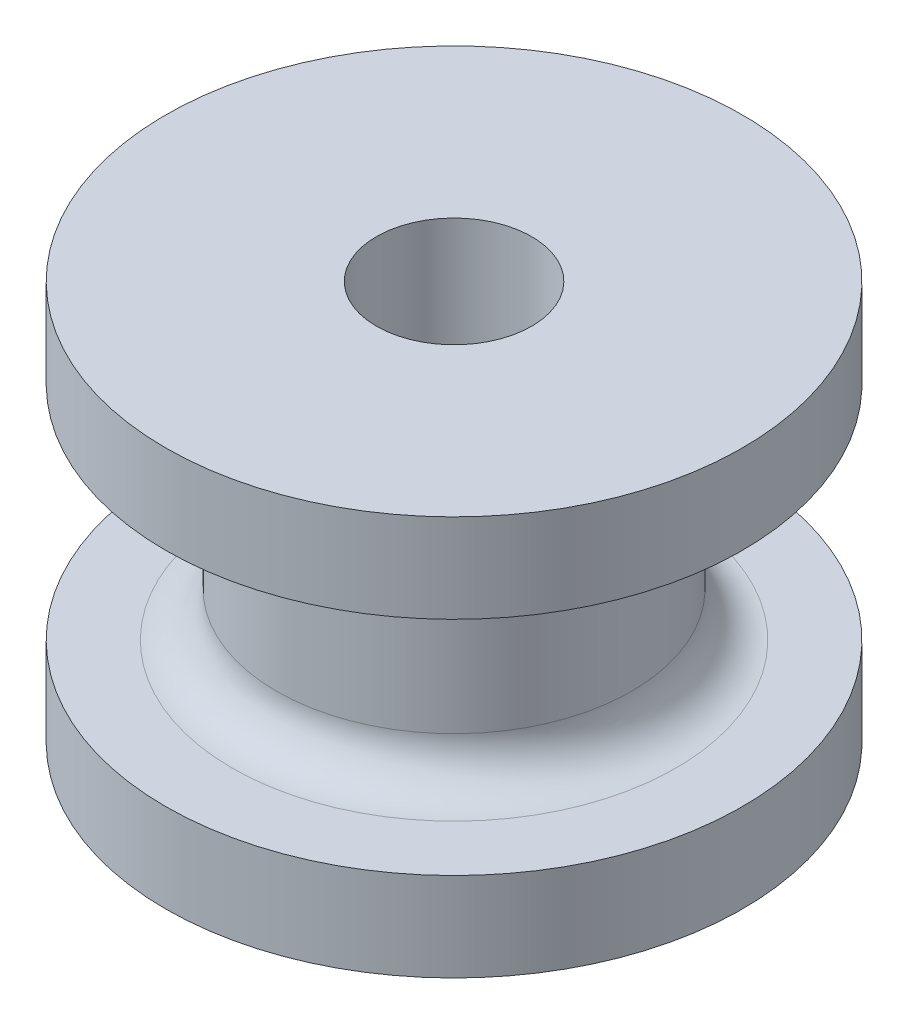
ISO-10303-21;
HEADER;
FILE_DESCRIPTION(('STEP AP214'),'2;1');
FILE_NAME('part.step','',(''),(''),'','','');
FILE_SCHEMA(('AUTOMOTIVE_DESIGN { 1 0 10303 214 1 1 1 1 }'));
ENDSEC;
DATA;
#1=APPLICATION_CONTEXT('core data for automotive mechanical design processes');
#2=APPLICATION_PROTOCOL_DEFINITION('international standard','automotive_design',2000,#1);
#3=PRODUCT_CONTEXT('',#1,'mechanical');
#4=PRODUCT('Part','Part','',(#3));
#5=PRODUCT_RELATED_PRODUCT_CATEGORY('part','',(#4));
#6=PRODUCT_DEFINITION_FORMATION('','',#4);
#7=PRODUCT_DEFINITION_CONTEXT('part definition',#1,'design');
#8=PRODUCT_DEFINITION('design','',#6,#7);
#9=PRODUCT_DEFINITION_SHAPE('','',#8);
#10=(LENGTH_UNIT() NAMED_UNIT(*) SI_UNIT(.MILLI.,.METRE.));
#11=(NAMED_UNIT(*) PLANE_ANGLE_UNIT() SI_UNIT($,.RADIAN.));
#12=(NAMED_UNIT(*) SI_UNIT($,.STERADIAN.) SOLID_ANGLE_UNIT());
#13=UNCERTAINTY_MEASURE_WITH_UNIT(LENGTH_MEASURE(1.E-05),#10,'distance_accuracy_value','');
#14=(GEOMETRIC_REPRESENTATION_CONTEXT(3) GLOBAL_UNCERTAINTY_ASSIGNED_CONTEXT((#13)) GLOBAL_UNIT_ASSIGNED_CONTEXT((#10,
#11,#12)) REPRESENTATION_CONTEXT('',''));
#15=CARTESIAN_POINT('',(0.,0.,0.));
#16=DIRECTION('',(0.,0.,1.));
#17=DIRECTION('',(1.,0.,0.));
#18=AXIS2_PLACEMENT_3D('',#15,#16,#17);
#19=CARTESIAN_POINT('',(0.,2.25,0.));
#20=DIRECTION('',(0.,-1.,0.));
#21=DIRECTION('',(0.,0.,-1.));
#22=AXIS2_PLACEMENT_3D('',#19,#20,#21);
#23=PLANE('',#22);
#24=CARTESIAN_POINT('',(0.,2.25,0.));
#25=DIRECTION('',(0.,1.,0.));
#26=DIRECTION('',(0.,0.,1.));
#27=AXIS2_PLACEMENT_3D('',#24,#25,#26);
#28=CIRCLE('',#27,0.875);
#29=CARTESIAN_POINT('',(0.,2.25,0.875000000000001));
#30=VERTEX_POINT('',#29);
#31=EDGE_CURVE('E62',#30,#30,#28,.T.);
#32=ORIENTED_EDGE('',*,*,#31,.F.);
#33=EDGE_LOOP('',(#32));
#34=FACE_BOUND('',#33,.T.);
#35=CARTESIAN_POINT('',(0.,2.25,0.));
#36=DIRECTION('',(0.,1.,0.));
#37=DIRECTION('',(0.,0.,1.));
#38=AXIS2_PLACEMENT_3D('',#35,#36,#37);
#39=CIRCLE('',#38,3.25);
#40=CARTESIAN_POINT('',(0.,2.25,3.25));
#41=VERTEX_POINT('',#40);
#42=EDGE_CURVE('E10',#41,#41,#39,.T.);
#43=ORIENTED_EDGE('',*,*,#42,.T.);
#44=EDGE_LOOP('',(#43));
#45=FACE_BOUND('',#44,.T.);
#46=ADVANCED_FACE('F30',(#34,#45),#23,.F.);
#47=CARTESIAN_POINT('',(0.,2.25,0.));
#48=DIRECTION('',(0.,1.,0.));
#49=DIRECTION('',(0.,0.,1.));
#50=AXIS2_PLACEMENT_3D('',#47,#48,#49);
#51=CYLINDRICAL_SURFACE('',#50,3.25);
#52=ORIENTED_EDGE('',*,*,#42,.F.);
#53=EDGE_LOOP('',(#52));
#54=FACE_BOUND('',#53,.T.);
#55=CARTESIAN_POINT('',(0.,1.25,0.));
#56=DIRECTION('',(0.,1.,0.));
#57=DIRECTION('',(0.,0.,1.));
#58=AXIS2_PLACEMENT_3D('',#55,#56,#57);
#59=CIRCLE('',#58,3.25);
#60=CARTESIAN_POINT('',(0.,1.25,3.25));
#61=VERTEX_POINT('',#60);
#62=EDGE_CURVE('E36',#61,#61,#59,.T.);
#63=ORIENTED_EDGE('',*,*,#62,.T.);
#64=EDGE_LOOP('',(#63));
#65=FACE_BOUND('',#64,.T.);
#66=ADVANCED_FACE('F78',(#54,#65),#51,.T.);
#67=CARTESIAN_POINT('',(0.,1.25,-3.25));
#68=DIRECTION('',(0.,1.,0.));
#69=DIRECTION('',(0.,0.,1.));
#70=AXIS2_PLACEMENT_3D('',#67,#68,#69);
#71=PLANE('',#70);
#72=ORIENTED_EDGE('',*,*,#62,.F.);
#73=EDGE_LOOP('',(#72));
#74=FACE_BOUND('',#73,.T.);
#75=CARTESIAN_POINT('',(0.,1.25,0.));
#76=DIRECTION('',(0.,1.,0.));
#77=DIRECTION('',(0.,0.,1.));
#78=AXIS2_PLACEMENT_3D('',#75,#76,#77);
#79=CIRCLE('',#78,2.5);
#80=CARTESIAN_POINT('',(0.,1.25,2.5));
#81=VERTEX_POINT('',#80);
#82=EDGE_CURVE('E40',#81,#81,#79,.T.);
#83=ORIENTED_EDGE('',*,*,#82,.T.);
#84=EDGE_LOOP('',(#83));
#85=FACE_BOUND('',#84,.T.);
#86=ADVANCED_FACE('F82',(#74,#85),#71,.F.);
#87=CARTESIAN_POINT('',(0.,0.749999999999998,0.));
#88=DIRECTION('',(0.,1.,0.));
#89=DIRECTION('',(0.,0.,1.));
#90=AXIS2_PLACEMENT_3D('',#87,#88,#89);
#91=TOROIDAL_SURFACE('',#90,2.5,0.5);
#92=ORIENTED_EDGE('',*,*,#82,.F.);
#93=EDGE_LOOP('',(#92));
#94=FACE_BOUND('',#93,.T.);
#95=CARTESIAN_POINT('',(0.,0.749999999999998,0.));
#96=DIRECTION('',(0.,1.,0.));
#97=DIRECTION('',(0.,0.,1.));
#98=AXIS2_PLACEMENT_3D('',#95,#96,#97);
#99=CIRCLE('',#98,2.);
#100=CARTESIAN_POINT('',(0.,0.749999999999998,2.));
#101=VERTEX_POINT('',#100);
#102=EDGE_CURVE('E44',#101,#101,#99,.T.);
#103=ORIENTED_EDGE('',*,*,#102,.T.);
#104=EDGE_LOOP('',(#103));
#105=FACE_BOUND('',#104,.T.);
#106=ADVANCED_FACE('F87',(#94,#105),#91,.F.);
#107=CARTESIAN_POINT('',(0.,2.25,0.));
#108=DIRECTION('',(0.,1.,0.));
#109=DIRECTION('',(0.,0.,1.));
#110=AXIS2_PLACEMENT_3D('',#107,#108,#109);
#111=CYLINDRICAL_SURFACE('',#110,2.);
#112=ORIENTED_EDGE('',*,*,#102,.F.);
#113=EDGE_LOOP('',(#112));
#114=FACE_BOUND('',#113,.T.);
#115=CARTESIAN_POINT('',(0.,-0.749999999999998,0.));
#116=DIRECTION('',(0.,1.,0.));
#117=DIRECTION('',(0.,0.,1.));
#118=AXIS2_PLACEMENT_3D('',#115,#116,#117);
#119=CIRCLE('',#118,2.);
#120=CARTESIAN_POINT('',(0.,-0.749999999999999,2.));
#121=VERTEX_POINT('',#120);
#122=EDGE_CURVE('E49',#121,#121,#119,.T.);
#123=ORIENTED_EDGE('',*,*,#122,.T.);
#124=EDGE_LOOP('',(#123));
#125=FACE_BOUND('',#124,.T.);
#126=ADVANCED_FACE('F93',(#114,#125),#111,.T.);
#127=CARTESIAN_POINT('',(0.,-0.749999999999998,0.));
#128=DIRECTION('',(0.,1.,0.));
#129=DIRECTION('',(0.,0.,1.));
#130=AXIS2_PLACEMENT_3D('',#127,#128,#129);
#131=TOROIDAL_SURFACE('',#130,2.5,0.5);
#132=ORIENTED_EDGE('',*,*,#122,.F.);
#133=EDGE_LOOP('',(#132));
#134=FACE_BOUND('',#133,.T.);
#135=CARTESIAN_POINT('',(0.,-1.25,0.));
#136=DIRECTION('',(0.,1.,0.));
#137=DIRECTION('',(0.,0.,1.));
#138=AXIS2_PLACEMENT_3D('',#135,#136,#137);
#139=CIRCLE('',#138,2.5);
#140=CARTESIAN_POINT('',(0.,-1.25,2.5));
#141=VERTEX_POINT('',#140);
#142=EDGE_CURVE('E52',#141,#141,#139,.T.);
#143=ORIENTED_EDGE('',*,*,#142,.T.);
#144=EDGE_LOOP('',(#143));
#145=FACE_BOUND('',#144,.T.);
#146=ADVANCED_FACE('F97',(#134,#145),#131,.F.);
#147=CARTESIAN_POINT('',(0.,-1.25,-2.5));
#148=DIRECTION('',(0.,-1.,0.));
#149=DIRECTION('',(0.,0.,-1.));
#150=AXIS2_PLACEMENT_3D('',#147,#148,#149);
#151=PLANE('',#150);
#152=ORIENTED_EDGE('',*,*,#142,.F.);
#153=EDGE_LOOP('',(#152));
#154=FACE_BOUND('',#153,.T.);
#155=CARTESIAN_POINT('',(0.,-1.25,0.));
#156=DIRECTION('',(0.,1.,0.));
#157=DIRECTION('',(0.,0.,1.));
#158=AXIS2_PLACEMENT_3D('',#155,#156,#157);
#159=CIRCLE('',#158,3.25);
#160=CARTESIAN_POINT('',(0.,-1.25,3.25));
#161=VERTEX_POINT('',#160);
#162=EDGE_CURVE('E55',#161,#161,#159,.T.);
#163=ORIENTED_EDGE('',*,*,#162,.T.);
#164=EDGE_LOOP('',(#163));
#165=FACE_BOUND('',#164,.T.);
#166=ADVANCED_FACE('F101',(#154,#165),#151,.F.);
#167=CARTESIAN_POINT('',(0.,2.25,0.));
#168=DIRECTION('',(0.,1.,0.));
#169=DIRECTION('',(0.,0.,1.));
#170=AXIS2_PLACEMENT_3D('',#167,#168,#169);
#171=CYLINDRICAL_SURFACE('',#170,3.25);
#172=ORIENTED_EDGE('',*,*,#162,.F.);
#173=EDGE_LOOP('',(#172));
#174=FACE_BOUND('',#173,.T.);
#175=CARTESIAN_POINT('',(0.,-2.25,0.));
#176=DIRECTION('',(0.,1.,0.));
#177=DIRECTION('',(0.,0.,1.));
#178=AXIS2_PLACEMENT_3D('',#175,#176,#177);
#179=CIRCLE('',#178,3.25);
#180=CARTESIAN_POINT('',(0.,-2.25,3.25));
#181=VERTEX_POINT('',#180);
#182=EDGE_CURVE('E58',#181,#181,#179,.T.);
#183=ORIENTED_EDGE('',*,*,#182,.T.);
#184=EDGE_LOOP('',(#183));
#185=FACE_BOUND('',#184,.T.);
#186=ADVANCED_FACE('F105',(#174,#185),#171,.T.);
#187=CARTESIAN_POINT('',(0.,-2.25,-3.25));
#188=DIRECTION('',(0.,1.,0.));
#189=DIRECTION('',(0.,0.,1.));
#190=AXIS2_PLACEMENT_3D('',#187,#188,#189);
#191=PLANE('',#190);
#192=CARTESIAN_POINT('',(0.,-2.25,0.));
#193=DIRECTION('',(0.,1.,0.));
#194=DIRECTION('',(0.,0.,1.));
#195=AXIS2_PLACEMENT_3D('',#192,#193,#194);
#196=CIRCLE('',#195,0.875);
#197=CARTESIAN_POINT('',(0.,-2.25,0.875000000000001));
#198=VERTEX_POINT('',#197);
#199=EDGE_CURVE('E61',#198,#198,#196,.T.);
#200=ORIENTED_EDGE('',*,*,#199,.T.);
#201=EDGE_LOOP('',(#200));
#202=FACE_BOUND('',#201,.T.);
#203=ORIENTED_EDGE('',*,*,#182,.F.);
#204=EDGE_LOOP('',(#203));
#205=FACE_BOUND('',#204,.T.);
#206=ADVANCED_FACE('F68',(#202,#205),#191,.F.);
#207=CARTESIAN_POINT('',(0.,-2.25,0.));
#208=DIRECTION('',(0.,1.,0.));
#209=DIRECTION('',(0.,0.,1.));
#210=AXIS2_PLACEMENT_3D('',#207,#208,#209);
#211=CYLINDRICAL_SURFACE('',#210,0.875);
#212=ORIENTED_EDGE('',*,*,#199,.F.);
#213=EDGE_LOOP('',(#212));
#214=FACE_BOUND('',#213,.T.);
#215=ORIENTED_EDGE('',*,*,#31,.T.);
#216=EDGE_LOOP('',(#215));
#217=FACE_BOUND('',#216,.T.);
#218=ADVANCED_FACE('F71',(#214,#217),#211,.F.);
#219=CLOSED_SHELL('',(#46,#66,#86,#106,#126,#146,#166,#186,#206,#218));
#220=MANIFOLD_SOLID_BREP('B2',#219);
#221=ADVANCED_BREP_SHAPE_REPRESENTATION('',(#18,#220),#14);
#222=SHAPE_DEFINITION_REPRESENTATION(#9,#221);
ENDSEC;
END-ISO-10303-21;
